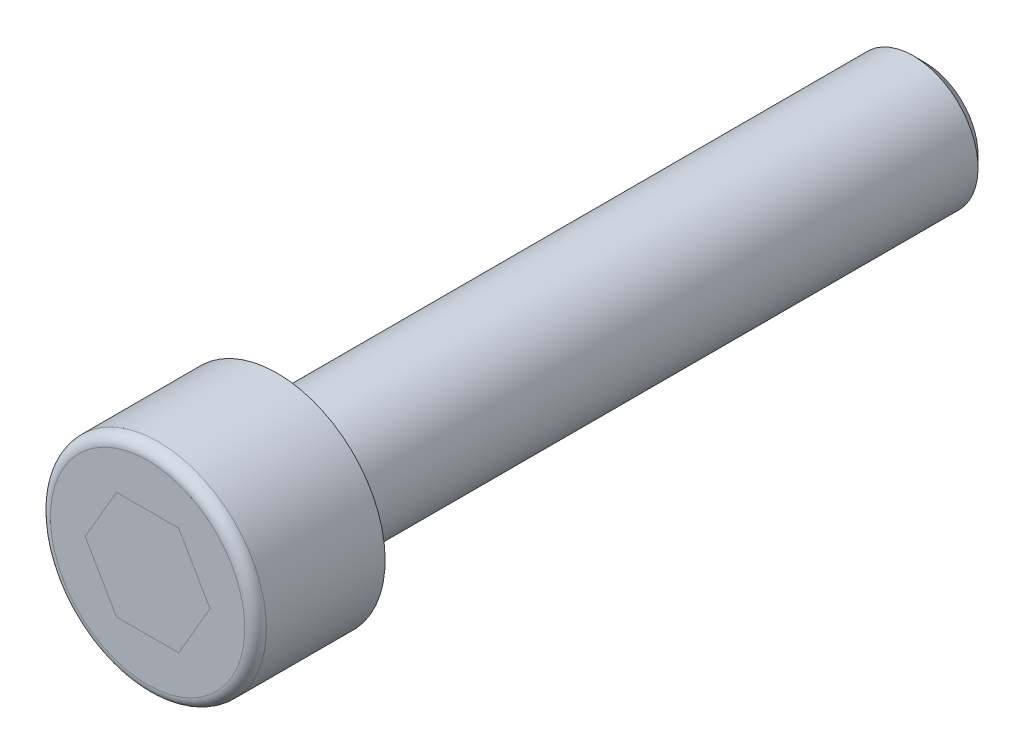
ISO-10303-21;
HEADER;
FILE_DESCRIPTION(('STEP AP214'),'2;1');
FILE_NAME('part.step','',(''),(''),'','','');
FILE_SCHEMA(('AUTOMOTIVE_DESIGN { 1 0 10303 214 1 1 1 1 }'));
ENDSEC;
DATA;
#1=APPLICATION_CONTEXT('core data for automotive mechanical design processes');
#2=APPLICATION_PROTOCOL_DEFINITION('international standard','automotive_design',2000,#1);
#3=PRODUCT_CONTEXT('',#1,'mechanical');
#4=PRODUCT('Part','Part','',(#3));
#5=PRODUCT_RELATED_PRODUCT_CATEGORY('part','',(#4));
#6=PRODUCT_DEFINITION_FORMATION('','',#4);
#7=PRODUCT_DEFINITION_CONTEXT('part definition',#1,'design');
#8=PRODUCT_DEFINITION('design','',#6,#7);
#9=PRODUCT_DEFINITION_SHAPE('','',#8);
#10=(LENGTH_UNIT() NAMED_UNIT(*) SI_UNIT(.MILLI.,.METRE.));
#11=(NAMED_UNIT(*) PLANE_ANGLE_UNIT() SI_UNIT($,.RADIAN.));
#12=(NAMED_UNIT(*) SI_UNIT($,.STERADIAN.) SOLID_ANGLE_UNIT());
#13=UNCERTAINTY_MEASURE_WITH_UNIT(LENGTH_MEASURE(1.E-05),#10,'distance_accuracy_value','');
#14=(GEOMETRIC_REPRESENTATION_CONTEXT(3) GLOBAL_UNCERTAINTY_ASSIGNED_CONTEXT((#13)) GLOBAL_UNIT_ASSIGNED_CONTEXT((#10,
#11,#12)) REPRESENTATION_CONTEXT('',''));
#15=CARTESIAN_POINT('',(0.,0.,0.));
#16=DIRECTION('',(0.,0.,1.));
#17=DIRECTION('',(1.,0.,0.));
#18=AXIS2_PLACEMENT_3D('',#15,#16,#17);
#19=CARTESIAN_POINT('',(0.,0.,6.));
#20=DIRECTION('',(0.,0.,-1.));
#21=DIRECTION('',(-1.,0.,0.));
#22=AXIS2_PLACEMENT_3D('',#19,#20,#21);
#23=PLANE('',#22);
#24=DIRECTION('',(-0.5,-0.866025403784439,0.));
#25=VECTOR('',#24,1.);
#26=CARTESIAN_POINT('',(2.65220178962874,-0.406249417187364,6.));
#27=LINE('',#26,#25);
#28=CARTESIAN_POINT('',(2.88675,0.,6.));
#29=VERTEX_POINT('',#28);
#30=CARTESIAN_POINT('',(1.443375,-2.49999883437473,6.));
#31=VERTEX_POINT('',#30);
#32=EDGE_CURVE('P0_E93',#29,#31,#27,.T.);
#33=ORIENTED_EDGE('',*,*,#32,.T.);
#34=DIRECTION('',(-1.,0.,0.));
#35=VECTOR('',#34,1.);
#36=CARTESIAN_POINT('',(0.,-2.49999883437473,6.));
#37=LINE('',#36,#35);
#38=CARTESIAN_POINT('',(-1.443375,-2.49999883437473,6.));
#39=VERTEX_POINT('',#38);
#40=EDGE_CURVE('P0_E110',#31,#39,#37,.T.);
#41=ORIENTED_EDGE('',*,*,#40,.T.);
#42=DIRECTION('',(-0.5,0.866025403784439,0.));
#43=VECTOR('',#42,1.);
#44=CARTESIAN_POINT('',(-2.65220178962874,-0.406249417187364,6.));
#45=LINE('',#44,#43);
#46=CARTESIAN_POINT('',(-2.88675,0.,6.));
#47=VERTEX_POINT('',#46);
#48=EDGE_CURVE('P0_E115',#39,#47,#45,.T.);
#49=ORIENTED_EDGE('',*,*,#48,.T.);
#50=DIRECTION('',(0.5,0.866025403784439,0.));
#51=VECTOR('',#50,1.);
#52=CARTESIAN_POINT('',(-1.67792321037125,2.09374941718736,6.));
#53=LINE('',#52,#51);
#54=CARTESIAN_POINT('',(-1.443375,2.49999883437473,6.));
#55=VERTEX_POINT('',#54);
#56=EDGE_CURVE('P0_E120',#47,#55,#53,.T.);
#57=ORIENTED_EDGE('',*,*,#56,.T.);
#58=DIRECTION('',(1.,0.,0.));
#59=VECTOR('',#58,1.);
#60=CARTESIAN_POINT('',(0.,2.49999883437473,6.));
#61=LINE('',#60,#59);
#62=CARTESIAN_POINT('',(1.443375,2.49999883437473,6.));
#63=VERTEX_POINT('',#62);
#64=EDGE_CURVE('P0_E89',#55,#63,#61,.T.);
#65=ORIENTED_EDGE('',*,*,#64,.T.);
#66=DIRECTION('',(0.5,-0.866025403784439,0.));
#67=VECTOR('',#66,1.);
#68=CARTESIAN_POINT('',(1.67792321037125,2.09374941718736,6.));
#69=LINE('',#68,#67);
#70=EDGE_CURVE('P0_E12',#63,#29,#69,.T.);
#71=ORIENTED_EDGE('',*,*,#70,.T.);
#72=EDGE_LOOP('',(#33,#41,#49,#57,#65,#71));
#73=FACE_BOUND('',#72,.T.);
#74=ADVANCED_FACE('P0_F83',(#73),#23,.T.);
#75=OPEN_SHELL('',(#74));
#76=SHELL_BASED_SURFACE_MODEL('P0_B2',(#75));
#77=CARTESIAN_POINT('',(0.,0.,2.16666705520842));
#78=DIRECTION('',(0.,0.,1.));
#79=DIRECTION('',(0.,1.,0.));
#80=AXIS2_PLACEMENT_3D('',#77,#78,#79);
#81=CONICAL_SURFACE('',#80,1.443375,1.0471975511966);
#82=CARTESIAN_POINT('',(1.443375,2.49999883437473,3.));
#83=CARTESIAN_POINT('',(2.1650625,1.24999941718736,2.58333352760421));
#84=CARTESIAN_POINT('',(2.88675,0.,3.));
#85=(BOUNDED_CURVE() B_SPLINE_CURVE(2,(#82,#83,#84),.UNSPECIFIED.,.F.,
.F.) B_SPLINE_CURVE_WITH_KNOTS((3,3),(0.,2.9210889832361),
.UNSPECIFIED.) CURVE() GEOMETRIC_REPRESENTATION_ITEM() RATIONAL_B_SPLINE_CURVE((1.,
1.15470053837926,1.)) REPRESENTATION_ITEM(''));
#86=CARTESIAN_POINT('',(1.443375,2.49999883437473,3.));
#87=VERTEX_POINT('',#86);
#88=CARTESIAN_POINT('',(2.88675,0.,3.));
#89=VERTEX_POINT('',#88);
#90=EDGE_CURVE('P1_E106',#87,#89,#85,.T.);
#91=ORIENTED_EDGE('',*,*,#90,.F.);
#92=CARTESIAN_POINT('',(-1.443375,2.49999883437473,3.));
#93=CARTESIAN_POINT('',(0.,2.49999883437473,2.58333352760421));
#94=CARTESIAN_POINT('',(1.443375,2.49999883437473,3.));
#95=(BOUNDED_CURVE() B_SPLINE_CURVE(2,(#92,#93,#94),.UNSPECIFIED.,.F.,
.F.) B_SPLINE_CURVE_WITH_KNOTS((3,3),(0.,2.92108898323611),
.UNSPECIFIED.) CURVE() GEOMETRIC_REPRESENTATION_ITEM() RATIONAL_B_SPLINE_CURVE((1.,
1.15470053837925,1.)) REPRESENTATION_ITEM(''));
#96=CARTESIAN_POINT('',(-1.443375,2.49999883437473,3.));
#97=VERTEX_POINT('',#96);
#98=EDGE_CURVE('P1_E39',#97,#87,#95,.T.);
#99=ORIENTED_EDGE('',*,*,#98,.F.);
#100=CARTESIAN_POINT('',(-2.88675,0.,3.));
#101=CARTESIAN_POINT('',(-2.1650625,1.24999941718736,2.58333352760422));
#102=CARTESIAN_POINT('',(-1.443375,2.49999883437473,3.));
#103=(BOUNDED_CURVE() B_SPLINE_CURVE(2,(#100,#101,#102),.UNSPECIFIED.,.F.,
.F.) B_SPLINE_CURVE_WITH_KNOTS((3,3),(0.,2.92108898323611),
.UNSPECIFIED.) CURVE() GEOMETRIC_REPRESENTATION_ITEM() RATIONAL_B_SPLINE_CURVE((1.,
1.15470053837925,1.)) REPRESENTATION_ITEM(''));
#104=CARTESIAN_POINT('',(-2.88675,0.,3.));
#105=VERTEX_POINT('',#104);
#106=EDGE_CURVE('P1_E114',#105,#97,#103,.T.);
#107=ORIENTED_EDGE('',*,*,#106,.F.);
#108=CARTESIAN_POINT('',(-1.443375,-2.49999883437473,3.));
#109=CARTESIAN_POINT('',(-2.1650625,-1.24999941718737,2.58333352760422));
#110=CARTESIAN_POINT('',(-2.88675,0.,3.));
#111=(BOUNDED_CURVE() B_SPLINE_CURVE(2,(#108,#109,#110),.UNSPECIFIED.,.F.,
.F.) B_SPLINE_CURVE_WITH_KNOTS((3,3),(0.,2.92108898323611),
.UNSPECIFIED.) CURVE() GEOMETRIC_REPRESENTATION_ITEM() RATIONAL_B_SPLINE_CURVE((1.,
1.15470053837925,1.)) REPRESENTATION_ITEM(''));
#112=CARTESIAN_POINT('',(-1.443375,-2.49999883437473,3.));
#113=VERTEX_POINT('',#112);
#114=EDGE_CURVE('P1_E11',#113,#105,#111,.T.);
#115=ORIENTED_EDGE('',*,*,#114,.F.);
#116=CARTESIAN_POINT('',(1.443375,-2.49999883437473,3.));
#117=CARTESIAN_POINT('',(0.,-2.49999883437473,2.58333352760421));
#118=CARTESIAN_POINT('',(-1.443375,-2.49999883437473,3.));
#119=(BOUNDED_CURVE() B_SPLINE_CURVE(2,(#116,#117,#118),.UNSPECIFIED.,.F.,
.F.) B_SPLINE_CURVE_WITH_KNOTS((3,3),(0.,2.92108898323611),
.UNSPECIFIED.) CURVE() GEOMETRIC_REPRESENTATION_ITEM() RATIONAL_B_SPLINE_CURVE((1.,
1.15470053837925,1.)) REPRESENTATION_ITEM(''));
#120=CARTESIAN_POINT('',(1.443375,-2.49999883437473,3.));
#121=VERTEX_POINT('',#120);
#122=EDGE_CURVE('P1_E90',#121,#113,#119,.T.);
#123=ORIENTED_EDGE('',*,*,#122,.F.);
#124=CARTESIAN_POINT('',(2.88675,0.,3.));
#125=CARTESIAN_POINT('',(2.1650625,-1.24999941718736,2.58333352760421));
#126=CARTESIAN_POINT('',(1.443375,-2.49999883437473,3.));
#127=(BOUNDED_CURVE() B_SPLINE_CURVE(2,(#124,#125,#126),.UNSPECIFIED.,.F.,
.F.) B_SPLINE_CURVE_WITH_KNOTS((3,3),(0.,2.9210889832361),
.UNSPECIFIED.) CURVE() GEOMETRIC_REPRESENTATION_ITEM() RATIONAL_B_SPLINE_CURVE((1.,
1.15470053837926,1.)) REPRESENTATION_ITEM(''));
#128=EDGE_CURVE('P1_E155',#89,#121,#127,.T.);
#129=ORIENTED_EDGE('',*,*,#128,.F.);
#130=EDGE_LOOP('',(#91,#99,#107,#115,#123,#129));
#131=FACE_BOUND('',#130,.T.);
#132=CARTESIAN_POINT('',(0.,0.,1.33333411041685));
#133=VERTEX_POINT('',#132);
#134=VERTEX_LOOP('',#133);
#135=FACE_BOUND('',#134,.T.);
#136=ADVANCED_FACE('P1_F19',(#131,#135),#81,.F.);
#137=CARTESIAN_POINT('',(-2.1650625,-1.24999941718736,6.));
#138=DIRECTION('',(-0.866025403784439,-0.5,0.));
#139=DIRECTION('',(-0.5,0.866025403784439,0.));
#140=AXIS2_PLACEMENT_3D('',#137,#138,#139);
#141=PLANE('',#140);
#142=ORIENTED_EDGE('',*,*,#114,.T.);
#143=DIRECTION('',(0.,0.,-1.));
#144=VECTOR('',#143,1.);
#145=CARTESIAN_POINT('',(-2.88675,0.,6.));
#146=LINE('',#145,#144);
#147=CARTESIAN_POINT('',(-2.88675,0.,6.));
#148=VERTEX_POINT('',#147);
#149=EDGE_CURVE('P1_E122',#148,#105,#146,.T.);
#150=ORIENTED_EDGE('',*,*,#149,.F.);
#151=DIRECTION('',(-0.5,0.866025403784439,0.));
#152=VECTOR('',#151,1.);
#153=CARTESIAN_POINT('',(-2.65220178962874,-0.406249417187364,6.));
#154=LINE('',#153,#152);
#155=CARTESIAN_POINT('',(-1.443375,-2.49999883437473,6.));
#156=VERTEX_POINT('',#155);
#157=EDGE_CURVE('P1_E104',#156,#148,#154,.T.);
#158=ORIENTED_EDGE('',*,*,#157,.F.);
#159=DIRECTION('',(0.,0.,-1.));
#160=VECTOR('',#159,1.);
#161=CARTESIAN_POINT('',(-1.443375,-2.49999883437473,6.));
#162=LINE('',#161,#160);
#163=EDGE_CURVE('P1_E30',#156,#113,#162,.T.);
#164=ORIENTED_EDGE('',*,*,#163,.T.);
#165=EDGE_LOOP('',(#142,#150,#158,#164));
#166=FACE_BOUND('',#165,.T.);
#167=ADVANCED_FACE('P1_F286',(#166),#141,.F.);
#168=CARTESIAN_POINT('',(0.,-2.49999883437473,6.));
#169=DIRECTION('',(0.,-1.,0.));
#170=DIRECTION('',(-1.,0.,0.));
#171=AXIS2_PLACEMENT_3D('',#168,#169,#170);
#172=PLANE('',#171);
#173=ORIENTED_EDGE('',*,*,#122,.T.);
#174=ORIENTED_EDGE('',*,*,#163,.F.);
#175=DIRECTION('',(-1.,0.,0.));
#176=VECTOR('',#175,1.);
#177=CARTESIAN_POINT('',(0.,-2.49999883437473,6.));
#178=LINE('',#177,#176);
#179=CARTESIAN_POINT('',(1.443375,-2.49999883437473,6.));
#180=VERTEX_POINT('',#179);
#181=EDGE_CURVE('P1_E88',#180,#156,#178,.T.);
#182=ORIENTED_EDGE('',*,*,#181,.F.);
#183=DIRECTION('',(0.,0.,-1.));
#184=VECTOR('',#183,1.);
#185=CARTESIAN_POINT('',(1.443375,-2.49999883437473,6.));
#186=LINE('',#185,#184);
#187=EDGE_CURVE('P1_E96',#180,#121,#186,.T.);
#188=ORIENTED_EDGE('',*,*,#187,.T.);
#189=EDGE_LOOP('',(#173,#174,#182,#188));
#190=FACE_BOUND('',#189,.T.);
#191=ADVANCED_FACE('P1_F291',(#190),#172,.F.);
#192=CARTESIAN_POINT('',(2.1650625,-1.24999941718736,6.));
#193=DIRECTION('',(0.866025403784439,-0.5,0.));
#194=DIRECTION('',(-0.5,-0.866025403784439,0.));
#195=AXIS2_PLACEMENT_3D('',#192,#193,#194);
#196=PLANE('',#195);
#197=ORIENTED_EDGE('',*,*,#128,.T.);
#198=ORIENTED_EDGE('',*,*,#187,.F.);
#199=DIRECTION('',(-0.5,-0.866025403784439,0.));
#200=VECTOR('',#199,1.);
#201=CARTESIAN_POINT('',(2.65220178962874,-0.406249417187364,6.));
#202=LINE('',#201,#200);
#203=CARTESIAN_POINT('',(2.88675,0.,6.));
#204=VERTEX_POINT('',#203);
#205=EDGE_CURVE('P1_E142',#204,#180,#202,.T.);
#206=ORIENTED_EDGE('',*,*,#205,.F.);
#207=DIRECTION('',(0.,0.,-1.));
#208=VECTOR('',#207,1.);
#209=CARTESIAN_POINT('',(2.88675,0.,6.));
#210=LINE('',#209,#208);
#211=EDGE_CURVE('P1_E112',#204,#89,#210,.T.);
#212=ORIENTED_EDGE('',*,*,#211,.T.);
#213=EDGE_LOOP('',(#197,#198,#206,#212));
#214=FACE_BOUND('',#213,.T.);
#215=ADVANCED_FACE('P1_F208',(#214),#196,.F.);
#216=CARTESIAN_POINT('',(2.1650625,1.24999941718736,6.));
#217=DIRECTION('',(0.866025403784439,0.5,0.));
#218=DIRECTION('',(0.5,-0.866025403784439,0.));
#219=AXIS2_PLACEMENT_3D('',#216,#217,#218);
#220=PLANE('',#219);
#221=ORIENTED_EDGE('',*,*,#90,.T.);
#222=ORIENTED_EDGE('',*,*,#211,.F.);
#223=DIRECTION('',(0.5,-0.866025403784439,0.));
#224=VECTOR('',#223,1.);
#225=CARTESIAN_POINT('',(1.67792321037125,2.09374941718736,6.));
#226=LINE('',#225,#224);
#227=CARTESIAN_POINT('',(1.443375,2.49999883437473,6.));
#228=VERTEX_POINT('',#227);
#229=EDGE_CURVE('P1_E146',#228,#204,#226,.T.);
#230=ORIENTED_EDGE('',*,*,#229,.F.);
#231=DIRECTION('',(0.,0.,-1.));
#232=VECTOR('',#231,1.);
#233=CARTESIAN_POINT('',(1.443375,2.49999883437473,6.));
#234=LINE('',#233,#232);
#235=EDGE_CURVE('P1_E113',#228,#87,#234,.T.);
#236=ORIENTED_EDGE('',*,*,#235,.T.);
#237=EDGE_LOOP('',(#221,#222,#230,#236));
#238=FACE_BOUND('',#237,.T.);
#239=ADVANCED_FACE('P1_F207',(#238),#220,.F.);
#240=CARTESIAN_POINT('',(0.,2.49999883437473,6.));
#241=DIRECTION('',(0.,1.,0.));
#242=DIRECTION('',(1.,0.,0.));
#243=AXIS2_PLACEMENT_3D('',#240,#241,#242);
#244=PLANE('',#243);
#245=ORIENTED_EDGE('',*,*,#98,.T.);
#246=ORIENTED_EDGE('',*,*,#235,.F.);
#247=DIRECTION('',(1.,0.,0.));
#248=VECTOR('',#247,1.);
#249=CARTESIAN_POINT('',(0.,2.49999883437473,6.));
#250=LINE('',#249,#248);
#251=CARTESIAN_POINT('',(-1.443375,2.49999883437473,6.));
#252=VERTEX_POINT('',#251);
#253=EDGE_CURVE('P1_E105',#252,#228,#250,.T.);
#254=ORIENTED_EDGE('',*,*,#253,.F.);
#255=DIRECTION('',(0.,0.,-1.));
#256=VECTOR('',#255,1.);
#257=CARTESIAN_POINT('',(-1.443375,2.49999883437473,6.));
#258=LINE('',#257,#256);
#259=EDGE_CURVE('P1_E121',#252,#97,#258,.T.);
#260=ORIENTED_EDGE('',*,*,#259,.T.);
#261=EDGE_LOOP('',(#245,#246,#254,#260));
#262=FACE_BOUND('',#261,.T.);
#263=ADVANCED_FACE('P1_F196',(#262),#244,.F.);
#264=CARTESIAN_POINT('',(-2.1650625,1.24999941718736,6.));
#265=DIRECTION('',(-0.866025403784439,0.5,0.));
#266=DIRECTION('',(0.5,0.866025403784439,0.));
#267=AXIS2_PLACEMENT_3D('',#264,#265,#266);
#268=PLANE('',#267);
#269=ORIENTED_EDGE('',*,*,#106,.T.);
#270=ORIENTED_EDGE('',*,*,#259,.F.);
#271=DIRECTION('',(0.5,0.866025403784439,0.));
#272=VECTOR('',#271,1.);
#273=CARTESIAN_POINT('',(-1.67792321037125,2.09374941718736,6.));
#274=LINE('',#273,#272);
#275=EDGE_CURVE('P1_E97',#148,#252,#274,.T.);
#276=ORIENTED_EDGE('',*,*,#275,.F.);
#277=ORIENTED_EDGE('',*,*,#149,.T.);
#278=EDGE_LOOP('',(#269,#270,#276,#277));
#279=FACE_BOUND('',#278,.T.);
#280=ADVANCED_FACE('P1_F199',(#279),#268,.F.);
#281=CARTESIAN_POINT('',(0.,0.,-14.229375));
#282=DIRECTION('',(0.,0.,1.));
#283=DIRECTION('',(0.,1.,0.));
#284=AXIS2_PLACEMENT_3D('',#281,#282,#283);
#285=CYLINDRICAL_SURFACE('',#284,3.);
#286=CARTESIAN_POINT('',(0.,0.,-29.45875));
#287=DIRECTION('',(0.,0.,-1.));
#288=DIRECTION('',(0.,1.,0.));
#289=AXIS2_PLACEMENT_3D('',#286,#287,#288);
#290=CIRCLE('',#289,3.);
#291=CARTESIAN_POINT('',(0.,3.,-29.45875));
#292=VERTEX_POINT('',#291);
#293=EDGE_CURVE('P1_E154',#292,#292,#290,.T.);
#294=ORIENTED_EDGE('',*,*,#293,.F.);
#295=EDGE_LOOP('',(#294));
#296=FACE_BOUND('',#295,.T.);
#297=CARTESIAN_POINT('',(0.,0.,0.));
#298=DIRECTION('',(0.,0.,1.));
#299=DIRECTION('',(0.,1.,0.));
#300=AXIS2_PLACEMENT_3D('',#297,#298,#299);
#301=CIRCLE('',#300,3.);
#302=CARTESIAN_POINT('',(0.,-3.,0.));
#303=VERTEX_POINT('',#302);
#304=EDGE_CURVE('P1_E77',#303,#303,#301,.T.);
#305=ORIENTED_EDGE('',*,*,#304,.F.);
#306=EDGE_LOOP('',(#305));
#307=FACE_BOUND('',#306,.T.);
#308=ADVANCED_FACE('P1_F271',(#296,#307),#285,.T.);
#309=CARTESIAN_POINT('',(0.,0.,-29.729375));
#310=DIRECTION('',(0.,0.,1.));
#311=DIRECTION('',(0.,1.,0.));
#312=AXIS2_PLACEMENT_3D('',#309,#310,#311);
#313=CONICAL_SURFACE('',#312,2.729375,0.78539816339745);
#314=CARTESIAN_POINT('',(0.,0.,-30.));
#315=DIRECTION('',(0.,0.,-1.));
#316=DIRECTION('',(0.,1.,0.));
#317=AXIS2_PLACEMENT_3D('',#314,#315,#316);
#318=CIRCLE('',#317,2.45875);
#319=CARTESIAN_POINT('',(0.,2.45875,-30.));
#320=VERTEX_POINT('',#319);
#321=EDGE_CURVE('P1_E140',#320,#320,#318,.T.);
#322=ORIENTED_EDGE('',*,*,#321,.F.);
#323=EDGE_LOOP('',(#322));
#324=FACE_BOUND('',#323,.T.);
#325=ORIENTED_EDGE('',*,*,#293,.T.);
#326=EDGE_LOOP('',(#325));
#327=FACE_BOUND('',#326,.T.);
#328=ADVANCED_FACE('P1_F269',(#324,#327),#313,.T.);
#329=CARTESIAN_POINT('',(0.,1.229375,-30.));
#330=DIRECTION('',(0.,0.,-1.));
#331=DIRECTION('',(0.,1.,0.));
#332=AXIS2_PLACEMENT_3D('',#329,#330,#331);
#333=PLANE('',#332);
#334=ORIENTED_EDGE('',*,*,#321,.T.);
#335=EDGE_LOOP('',(#334));
#336=FACE_BOUND('',#335,.T.);
#337=ADVANCED_FACE('P1_F300',(#336),#333,.T.);
#338=CARTESIAN_POINT('',(0.,2.25,6.));
#339=DIRECTION('',(0.,0.,1.));
#340=DIRECTION('',(0.,-1.,0.));
#341=AXIS2_PLACEMENT_3D('',#338,#339,#340);
#342=PLANE('',#341);
#343=ORIENTED_EDGE('',*,*,#157,.T.);
#344=ORIENTED_EDGE('',*,*,#275,.T.);
#345=ORIENTED_EDGE('',*,*,#253,.T.);
#346=ORIENTED_EDGE('',*,*,#229,.T.);
#347=ORIENTED_EDGE('',*,*,#205,.T.);
#348=ORIENTED_EDGE('',*,*,#181,.T.);
#349=EDGE_LOOP('',(#343,#344,#345,#346,#347,#348));
#350=FACE_BOUND('',#349,.T.);
#351=CARTESIAN_POINT('',(0.,0.,6.));
#352=DIRECTION('',(0.,0.,-1.));
#353=DIRECTION('',(0.,1.,0.));
#354=AXIS2_PLACEMENT_3D('',#351,#352,#353);
#355=CIRCLE('',#354,4.5);
#356=CARTESIAN_POINT('',(0.,4.5,6.));
#357=VERTEX_POINT('',#356);
#358=EDGE_CURVE('P1_E182',#357,#357,#355,.T.);
#359=ORIENTED_EDGE('',*,*,#358,.F.);
#360=EDGE_LOOP('',(#359));
#361=FACE_BOUND('',#360,.T.);
#362=ADVANCED_FACE('P1_F192',(#350,#361),#342,.T.);
#363=CARTESIAN_POINT('',(0.,0.,5.5));
#364=DIRECTION('',(0.,0.,-1.));
#365=DIRECTION('',(-1.,0.,0.));
#366=AXIS2_PLACEMENT_3D('',#363,#364,#365);
#367=TOROIDAL_SURFACE('',#366,4.5,0.5);
#368=CARTESIAN_POINT('',(0.,0.,5.5));
#369=DIRECTION('',(0.,0.,-1.));
#370=DIRECTION('',(0.,1.,0.));
#371=AXIS2_PLACEMENT_3D('',#368,#369,#370);
#372=CIRCLE('',#371,5.);
#373=CARTESIAN_POINT('',(0.,5.,5.5));
#374=VERTEX_POINT('',#373);
#375=EDGE_CURVE('P1_E23',#374,#374,#372,.T.);
#376=ORIENTED_EDGE('',*,*,#375,.F.);
#377=EDGE_LOOP('',(#376));
#378=FACE_BOUND('',#377,.T.);
#379=ORIENTED_EDGE('',*,*,#358,.T.);
#380=EDGE_LOOP('',(#379));
#381=FACE_BOUND('',#380,.T.);
#382=ADVANCED_FACE('P1_F283',(#378,#381),#367,.T.);
#383=CARTESIAN_POINT('',(0.,0.,2.75));
#384=DIRECTION('',(0.,0.,1.));
#385=DIRECTION('',(0.,1.,0.));
#386=AXIS2_PLACEMENT_3D('',#383,#384,#385);
#387=CYLINDRICAL_SURFACE('',#386,5.);
#388=CARTESIAN_POINT('',(0.,0.,0.));
#389=DIRECTION('',(0.,0.,-1.));
#390=DIRECTION('',(0.,1.,0.));
#391=AXIS2_PLACEMENT_3D('',#388,#389,#390);
#392=CIRCLE('',#391,5.);
#393=CARTESIAN_POINT('',(0.,5.,0.));
#394=VERTEX_POINT('',#393);
#395=EDGE_CURVE('P1_E72',#394,#394,#392,.T.);
#396=ORIENTED_EDGE('',*,*,#395,.F.);
#397=EDGE_LOOP('',(#396));
#398=FACE_BOUND('',#397,.T.);
#399=ORIENTED_EDGE('',*,*,#375,.T.);
#400=EDGE_LOOP('',(#399));
#401=FACE_BOUND('',#400,.T.);
#402=ADVANCED_FACE('P1_F73',(#398,#401),#387,.T.);
#403=CARTESIAN_POINT('',(0.,2.5,0.));
#404=DIRECTION('',(0.,0.,-1.));
#405=DIRECTION('',(0.,1.,0.));
#406=AXIS2_PLACEMENT_3D('',#403,#404,#405);
#407=PLANE('',#406);
#408=ORIENTED_EDGE('',*,*,#304,.T.);
#409=EDGE_LOOP('',(#408));
#410=FACE_BOUND('',#409,.T.);
#411=ORIENTED_EDGE('',*,*,#395,.T.);
#412=EDGE_LOOP('',(#411));
#413=FACE_BOUND('',#412,.T.);
#414=ADVANCED_FACE('P1_F21',(#410,#413),#407,.T.);
#415=CLOSED_SHELL('',(#136,#167,#191,#215,#239,#263,#280,#308,#328,#337,#362,#382,#402,#414));
#416=MANIFOLD_SOLID_BREP('P1_B1',#415);
#417=ADVANCED_BREP_SHAPE_REPRESENTATION('',(#18,#416),#14);
#418=MANIFOLD_SURFACE_SHAPE_REPRESENTATION('',(#18,#76),#14);
#419=SHAPE_REPRESENTATION('',(#18),#14);
#420=SHAPE_DEFINITION_REPRESENTATION(#9,#419);
#421=SHAPE_REPRESENTATION_RELATIONSHIP('','',#419,#417);
#422=SHAPE_REPRESENTATION_RELATIONSHIP('','',#419,#418);
ENDSEC;
END-ISO-10303-21;
